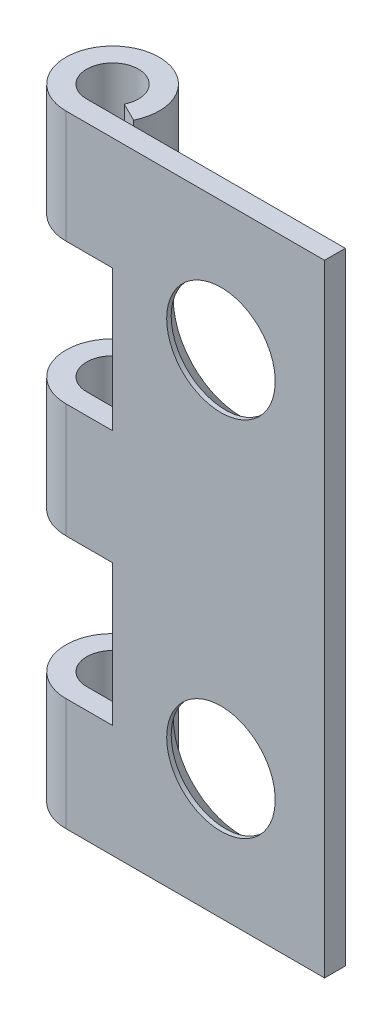
ISO-10303-21;
HEADER;
FILE_DESCRIPTION(('STEP AP214'),'2;1');
FILE_NAME('part.step','',(''),(''),'','','');
FILE_SCHEMA(('AUTOMOTIVE_DESIGN { 1 0 10303 214 1 1 1 1 }'));
ENDSEC;
DATA;
#1=APPLICATION_CONTEXT('core data for automotive mechanical design processes');
#2=APPLICATION_PROTOCOL_DEFINITION('international standard','automotive_design',2000,#1);
#3=PRODUCT_CONTEXT('',#1,'mechanical');
#4=PRODUCT('Part','Part','',(#3));
#5=PRODUCT_RELATED_PRODUCT_CATEGORY('part','',(#4));
#6=PRODUCT_DEFINITION_FORMATION('','',#4);
#7=PRODUCT_DEFINITION_CONTEXT('part definition',#1,'design');
#8=PRODUCT_DEFINITION('design','',#6,#7);
#9=PRODUCT_DEFINITION_SHAPE('','',#8);
#10=(LENGTH_UNIT() NAMED_UNIT(*) SI_UNIT(.MILLI.,.METRE.));
#11=(NAMED_UNIT(*) PLANE_ANGLE_UNIT() SI_UNIT($,.RADIAN.));
#12=(NAMED_UNIT(*) SI_UNIT($,.STERADIAN.) SOLID_ANGLE_UNIT());
#13=UNCERTAINTY_MEASURE_WITH_UNIT(LENGTH_MEASURE(1.E-05),#10,'distance_accuracy_value','');
#14=(GEOMETRIC_REPRESENTATION_CONTEXT(3) GLOBAL_UNCERTAINTY_ASSIGNED_CONTEXT((#13)) GLOBAL_UNIT_ASSIGNED_CONTEXT((#10,
#11,#12)) REPRESENTATION_CONTEXT('',''));
#15=CARTESIAN_POINT('',(0.,0.,0.));
#16=DIRECTION('',(0.,0.,1.));
#17=DIRECTION('',(1.,0.,0.));
#18=AXIS2_PLACEMENT_3D('',#15,#16,#17);
#19=CARTESIAN_POINT('',(0.,9.525,0.));
#20=DIRECTION('',(0.,-1.,0.));
#21=DIRECTION('',(0.,0.,-1.));
#22=AXIS2_PLACEMENT_3D('',#19,#20,#21);
#23=CYLINDRICAL_SURFACE('',#22,0.79375);
#24=DIRECTION('',(0.,-1.,0.));
#25=VECTOR('',#24,1.);
#26=CARTESIAN_POINT('',(0.,9.525,0.79375));
#27=LINE('',#26,#25);
#28=CARTESIAN_POINT('',(0.,1.7526,0.79375));
#29=VERTEX_POINT('',#28);
#30=CARTESIAN_POINT('',(0.,-1.7526,0.79375));
#31=VERTEX_POINT('',#30);
#32=EDGE_CURVE('E276',#29,#31,#27,.T.);
#33=ORIENTED_EDGE('',*,*,#32,.T.);
#34=CARTESIAN_POINT('',(0.,-1.7526,0.));
#35=DIRECTION('',(0.,1.,0.));
#36=DIRECTION('',(0.,0.,1.));
#37=AXIS2_PLACEMENT_3D('',#34,#35,#36);
#38=CIRCLE('',#37,0.79375);
#39=CARTESIAN_POINT('',(0.711046343079108,-1.7526,0.352777777777778));
#40=VERTEX_POINT('',#39);
#41=EDGE_CURVE('E189',#31,#40,#38,.F.);
#42=ORIENTED_EDGE('',*,*,#41,.T.);
#43=DIRECTION('',(0.,-1.,0.));
#44=VECTOR('',#43,1.);
#45=CARTESIAN_POINT('',(0.711046343079108,9.525,0.352777777777778));
#46=LINE('',#45,#44);
#47=CARTESIAN_POINT('',(0.711046343079108,1.7526,0.352777777777778));
#48=VERTEX_POINT('',#47);
#49=EDGE_CURVE('E297',#48,#40,#46,.T.);
#50=ORIENTED_EDGE('',*,*,#49,.F.);
#51=CARTESIAN_POINT('',(0.,1.7526,0.));
#52=DIRECTION('',(0.,-1.,0.));
#53=DIRECTION('',(0.,0.,-1.));
#54=AXIS2_PLACEMENT_3D('',#51,#52,#53);
#55=CIRCLE('',#54,0.79375);
#56=EDGE_CURVE('E207',#48,#29,#55,.F.);
#57=ORIENTED_EDGE('',*,*,#56,.T.);
#58=EDGE_LOOP('',(#33,#42,#50,#57));
#59=FACE_BOUND('',#58,.T.);
#60=ADVANCED_FACE('F33',(#59),#23,.F.);
#61=CARTESIAN_POINT('',(1.2798834175424,9.525,0.635));
#62=DIRECTION('',(0.444444444444444,0.,-0.895806416477617));
#63=DIRECTION('',(-0.895806416477617,0.,-0.444444444444444));
#64=AXIS2_PLACEMENT_3D('',#61,#62,#63);
#65=PLANE('',#64);
#66=ORIENTED_EDGE('',*,*,#49,.T.);
#67=DIRECTION('',(0.895806416477617,0.,0.444444444444444));
#68=VECTOR('',#67,1.);
#69=CARTESIAN_POINT('',(1.2798834175424,-1.7526,0.635));
#70=LINE('',#69,#68);
#71=CARTESIAN_POINT('',(1.2798834175424,-1.7526,0.635));
#72=VERTEX_POINT('',#71);
#73=EDGE_CURVE('E192',#40,#72,#70,.T.);
#74=ORIENTED_EDGE('',*,*,#73,.T.);
#75=DIRECTION('',(0.,-1.,0.));
#76=VECTOR('',#75,1.);
#77=CARTESIAN_POINT('',(1.2798834175424,9.525,0.635));
#78=LINE('',#77,#76);
#79=CARTESIAN_POINT('',(1.2798834175424,1.7526,0.635));
#80=VERTEX_POINT('',#79);
#81=EDGE_CURVE('E292',#80,#72,#78,.T.);
#82=ORIENTED_EDGE('',*,*,#81,.F.);
#83=DIRECTION('',(-0.895806416477617,0.,-0.444444444444444));
#84=VECTOR('',#83,1.);
#85=CARTESIAN_POINT('',(1.2798834175424,1.7526,0.635));
#86=LINE('',#85,#84);
#87=EDGE_CURVE('E211',#80,#48,#86,.T.);
#88=ORIENTED_EDGE('',*,*,#87,.T.);
#89=EDGE_LOOP('',(#66,#74,#82,#88));
#90=FACE_BOUND('',#89,.T.);
#91=ADVANCED_FACE('F320',(#90),#65,.F.);
#92=CARTESIAN_POINT('',(0.,9.525,0.));
#93=DIRECTION('',(0.,-1.,0.));
#94=DIRECTION('',(0.,0.,-1.));
#95=AXIS2_PLACEMENT_3D('',#92,#93,#94);
#96=CYLINDRICAL_SURFACE('',#95,1.42875);
#97=ORIENTED_EDGE('',*,*,#81,.T.);
#98=CARTESIAN_POINT('',(0.,-1.7526,0.));
#99=DIRECTION('',(0.,1.,0.));
#100=DIRECTION('',(0.,0.,1.));
#101=AXIS2_PLACEMENT_3D('',#98,#99,#100);
#102=CIRCLE('',#101,1.42875);
#103=CARTESIAN_POINT('',(0.,-1.7526,1.42875));
#104=VERTEX_POINT('',#103);
#105=EDGE_CURVE('E195',#72,#104,#102,.T.);
#106=ORIENTED_EDGE('',*,*,#105,.T.);
#107=DIRECTION('',(0.,-1.,0.));
#108=VECTOR('',#107,1.);
#109=CARTESIAN_POINT('',(0.,9.525,1.42875));
#110=LINE('',#109,#108);
#111=CARTESIAN_POINT('',(0.,1.7526,1.42875));
#112=VERTEX_POINT('',#111);
#113=EDGE_CURVE('E287',#112,#104,#110,.T.);
#114=ORIENTED_EDGE('',*,*,#113,.F.);
#115=CARTESIAN_POINT('',(0.,1.7526,0.));
#116=DIRECTION('',(0.,-1.,0.));
#117=DIRECTION('',(0.,0.,-1.));
#118=AXIS2_PLACEMENT_3D('',#115,#116,#117);
#119=CIRCLE('',#118,1.42875);
#120=EDGE_CURVE('E214',#112,#80,#119,.T.);
#121=ORIENTED_EDGE('',*,*,#120,.T.);
#122=EDGE_LOOP('',(#97,#106,#114,#121));
#123=FACE_BOUND('',#122,.T.);
#124=ADVANCED_FACE('F329',(#123),#96,.T.);
#125=CARTESIAN_POINT('',(0.,9.525,0.79375));
#126=VERTEX_POINT('',#125);
#127=CARTESIAN_POINT('',(0.,6.0706,0.79375));
#128=VERTEX_POINT('',#127);
#129=EDGE_CURVE('E272',#126,#128,#27,.T.);
#130=ORIENTED_EDGE('',*,*,#129,.T.);
#131=CARTESIAN_POINT('',(0.,6.0706,0.));
#132=DIRECTION('',(0.,1.,0.));
#133=DIRECTION('',(0.,0.,1.));
#134=AXIS2_PLACEMENT_3D('',#131,#132,#133);
#135=CIRCLE('',#134,0.79375);
#136=CARTESIAN_POINT('',(0.711046343079108,6.0706,0.352777777777778));
#137=VERTEX_POINT('',#136);
#138=EDGE_CURVE('E216',#128,#137,#135,.F.);
#139=ORIENTED_EDGE('',*,*,#138,.T.);
#140=CARTESIAN_POINT('',(0.711046343079108,9.525,0.352777777777778));
#141=VERTEX_POINT('',#140);
#142=EDGE_CURVE('E293',#141,#137,#46,.T.);
#143=ORIENTED_EDGE('',*,*,#142,.F.);
#144=CARTESIAN_POINT('',(0.,9.525,0.));
#145=DIRECTION('',(0.,-1.,0.));
#146=DIRECTION('',(0.,0.,1.));
#147=AXIS2_PLACEMENT_3D('',#144,#145,#146);
#148=CIRCLE('',#147,0.79375);
#149=EDGE_CURVE('E243',#126,#141,#148,.T.);
#150=ORIENTED_EDGE('',*,*,#149,.F.);
#151=EDGE_LOOP('',(#130,#139,#143,#150));
#152=FACE_BOUND('',#151,.T.);
#153=ADVANCED_FACE('F366',(#152),#23,.F.);
#154=ORIENTED_EDGE('',*,*,#142,.T.);
#155=DIRECTION('',(0.895806416477617,0.,0.444444444444444));
#156=VECTOR('',#155,1.);
#157=CARTESIAN_POINT('',(1.2798834175424,6.0706,0.635));
#158=LINE('',#157,#156);
#159=CARTESIAN_POINT('',(1.2798834175424,6.0706,0.635));
#160=VERTEX_POINT('',#159);
#161=EDGE_CURVE('E219',#137,#160,#158,.T.);
#162=ORIENTED_EDGE('',*,*,#161,.T.);
#163=CARTESIAN_POINT('',(1.2798834175424,9.525,0.635));
#164=VERTEX_POINT('',#163);
#165=EDGE_CURVE('E288',#164,#160,#78,.T.);
#166=ORIENTED_EDGE('',*,*,#165,.F.);
#167=DIRECTION('',(0.895806416477617,0.,0.444444444444444));
#168=VECTOR('',#167,1.);
#169=CARTESIAN_POINT('',(1.2798834175424,9.525,0.635));
#170=LINE('',#169,#168);
#171=EDGE_CURVE('E246',#141,#164,#170,.T.);
#172=ORIENTED_EDGE('',*,*,#171,.F.);
#173=EDGE_LOOP('',(#154,#162,#166,#172));
#174=FACE_BOUND('',#173,.T.);
#175=ADVANCED_FACE('F369',(#174),#65,.F.);
#176=ORIENTED_EDGE('',*,*,#165,.T.);
#177=CARTESIAN_POINT('',(0.,6.0706,0.));
#178=DIRECTION('',(0.,1.,0.));
#179=DIRECTION('',(0.,0.,1.));
#180=AXIS2_PLACEMENT_3D('',#177,#178,#179);
#181=CIRCLE('',#180,1.42875);
#182=CARTESIAN_POINT('',(0.,6.0706,1.42875));
#183=VERTEX_POINT('',#182);
#184=EDGE_CURVE('E222',#160,#183,#181,.T.);
#185=ORIENTED_EDGE('',*,*,#184,.T.);
#186=CARTESIAN_POINT('',(0.,9.525,1.42875));
#187=VERTEX_POINT('',#186);
#188=EDGE_CURVE('E283',#187,#183,#110,.T.);
#189=ORIENTED_EDGE('',*,*,#188,.F.);
#190=CARTESIAN_POINT('',(0.,9.525,0.));
#191=DIRECTION('',(0.,1.,0.));
#192=DIRECTION('',(0.,0.,1.));
#193=AXIS2_PLACEMENT_3D('',#190,#191,#192);
#194=CIRCLE('',#193,1.42875);
#195=EDGE_CURVE('E249',#164,#187,#194,.T.);
#196=ORIENTED_EDGE('',*,*,#195,.F.);
#197=EDGE_LOOP('',(#176,#185,#189,#196));
#198=FACE_BOUND('',#197,.T.);
#199=ADVANCED_FACE('F355',(#198),#96,.T.);
#200=CARTESIAN_POINT('',(0.711046343079108,-6.0706,0.352777777777778));
#201=VERTEX_POINT('',#200);
#202=CARTESIAN_POINT('',(0.711046343079108,-9.525,0.352777777777778));
#203=VERTEX_POINT('',#202);
#204=EDGE_CURVE('E291',#201,#203,#46,.T.);
#205=ORIENTED_EDGE('',*,*,#204,.F.);
#206=CARTESIAN_POINT('',(0.,-6.0706,0.));
#207=DIRECTION('',(0.,-1.,0.));
#208=DIRECTION('',(0.,0.,-1.));
#209=AXIS2_PLACEMENT_3D('',#206,#207,#208);
#210=CIRCLE('',#209,0.79375);
#211=CARTESIAN_POINT('',(0.,-6.0706,0.79375));
#212=VERTEX_POINT('',#211);
#213=EDGE_CURVE('E181',#201,#212,#210,.F.);
#214=ORIENTED_EDGE('',*,*,#213,.T.);
#215=CARTESIAN_POINT('',(0.,-9.525,0.79375));
#216=VERTEX_POINT('',#215);
#217=EDGE_CURVE('E257',#212,#216,#27,.T.);
#218=ORIENTED_EDGE('',*,*,#217,.T.);
#219=CARTESIAN_POINT('',(0.,-9.525,0.));
#220=DIRECTION('',(0.,-1.,0.));
#221=DIRECTION('',(0.,0.,1.));
#222=AXIS2_PLACEMENT_3D('',#219,#220,#221);
#223=CIRCLE('',#222,0.79375);
#224=EDGE_CURVE('E242',#216,#203,#223,.T.);
#225=ORIENTED_EDGE('',*,*,#224,.T.);
#226=EDGE_LOOP('',(#205,#214,#218,#225));
#227=FACE_BOUND('',#226,.T.);
#228=ADVANCED_FACE('F35',(#227),#23,.F.);
#229=CARTESIAN_POINT('',(1.2798834175424,-6.0706,0.635));
#230=VERTEX_POINT('',#229);
#231=CARTESIAN_POINT('',(1.2798834175424,-9.525,0.635));
#232=VERTEX_POINT('',#231);
#233=EDGE_CURVE('E286',#230,#232,#78,.T.);
#234=ORIENTED_EDGE('',*,*,#233,.F.);
#235=DIRECTION('',(-0.895806416477617,0.,-0.444444444444444));
#236=VECTOR('',#235,1.);
#237=CARTESIAN_POINT('',(1.2798834175424,-6.0706,0.635));
#238=LINE('',#237,#236);
#239=EDGE_CURVE('E185',#230,#201,#238,.T.);
#240=ORIENTED_EDGE('',*,*,#239,.T.);
#241=ORIENTED_EDGE('',*,*,#204,.T.);
#242=DIRECTION('',(0.895806416477617,0.,0.444444444444444));
#243=VECTOR('',#242,1.);
#244=CARTESIAN_POINT('',(1.2798834175424,-9.525,0.635));
#245=LINE('',#244,#243);
#246=EDGE_CURVE('E260',#203,#232,#245,.T.);
#247=ORIENTED_EDGE('',*,*,#246,.T.);
#248=EDGE_LOOP('',(#234,#240,#241,#247));
#249=FACE_BOUND('',#248,.T.);
#250=ADVANCED_FACE('F335',(#249),#65,.F.);
#251=CARTESIAN_POINT('',(0.,-6.0706,0.));
#252=DIRECTION('',(0.,-1.,0.));
#253=DIRECTION('',(0.,0.,-1.));
#254=AXIS2_PLACEMENT_3D('',#251,#252,#253);
#255=CIRCLE('',#254,1.42875);
#256=CARTESIAN_POINT('',(0.,-6.0706,1.42875));
#257=VERTEX_POINT('',#256);
#258=EDGE_CURVE('E159',#257,#230,#255,.T.);
#259=ORIENTED_EDGE('',*,*,#258,.T.);
#260=ORIENTED_EDGE('',*,*,#233,.T.);
#261=CARTESIAN_POINT('',(0.,-9.525,0.));
#262=DIRECTION('',(0.,1.,0.));
#263=DIRECTION('',(0.,0.,1.));
#264=AXIS2_PLACEMENT_3D('',#261,#262,#263);
#265=CIRCLE('',#264,1.42875);
#266=CARTESIAN_POINT('',(0.,-9.525,1.42875));
#267=VERTEX_POINT('',#266);
#268=EDGE_CURVE('E263',#232,#267,#265,.T.);
#269=ORIENTED_EDGE('',*,*,#268,.T.);
#270=EDGE_CURVE('E282',#257,#267,#110,.T.);
#271=ORIENTED_EDGE('',*,*,#270,.F.);
#272=EDGE_LOOP('',(#259,#260,#269,#271));
#273=FACE_BOUND('',#272,.T.);
#274=ADVANCED_FACE('F332',(#273),#96,.T.);
#275=CARTESIAN_POINT('',(7.9248,9.525,1.42875));
#276=DIRECTION('',(0.,0.,-1.));
#277=DIRECTION('',(-1.,0.,0.));
#278=AXIS2_PLACEMENT_3D('',#275,#276,#277);
#279=PLANE('',#278);
#280=CARTESIAN_POINT('',(4.7498,-5.55625,1.42875));
#281=DIRECTION('',(0.,0.,-1.));
#282=DIRECTION('',(-1.,0.,0.));
#283=AXIS2_PLACEMENT_3D('',#280,#281,#282);
#284=CIRCLE('',#283,1.6637);
#285=CARTESIAN_POINT('',(3.0861,-5.55625,1.42875));
#286=VERTEX_POINT('',#285);
#287=EDGE_CURVE('E224',#286,#286,#284,.T.);
#288=ORIENTED_EDGE('',*,*,#287,.T.);
#289=EDGE_LOOP('',(#288));
#290=FACE_BOUND('',#289,.T.);
#291=CARTESIAN_POINT('',(4.7498,5.55625,1.42875));
#292=DIRECTION('',(0.,0.,-1.));
#293=DIRECTION('',(-1.,0.,0.));
#294=AXIS2_PLACEMENT_3D('',#291,#292,#293);
#295=CIRCLE('',#294,1.6637);
#296=CARTESIAN_POINT('',(3.0861,5.55625,1.42875));
#297=VERTEX_POINT('',#296);
#298=EDGE_CURVE('E233',#297,#297,#295,.T.);
#299=ORIENTED_EDGE('',*,*,#298,.T.);
#300=EDGE_LOOP('',(#299));
#301=FACE_BOUND('',#300,.T.);
#302=ORIENTED_EDGE('',*,*,#113,.T.);
#303=DIRECTION('',(-1.,0.,0.));
#304=VECTOR('',#303,1.);
#305=CARTESIAN_POINT('',(-1.42875,-1.7526,1.42875));
#306=LINE('',#305,#304);
#307=CARTESIAN_POINT('',(1.42875,-1.7526,1.42875));
#308=VERTEX_POINT('',#307);
#309=EDGE_CURVE('E173',#308,#104,#306,.T.);
#310=ORIENTED_EDGE('',*,*,#309,.F.);
#311=DIRECTION('',(0.,1.,0.));
#312=VECTOR('',#311,1.);
#313=CARTESIAN_POINT('',(1.42875,-1.7526,1.42875));
#314=LINE('',#313,#312);
#315=CARTESIAN_POINT('',(1.42875,-6.0706,1.42875));
#316=VERTEX_POINT('',#315);
#317=EDGE_CURVE('E163',#316,#308,#314,.T.);
#318=ORIENTED_EDGE('',*,*,#317,.F.);
#319=DIRECTION('',(1.,0.,0.));
#320=VECTOR('',#319,1.);
#321=CARTESIAN_POINT('',(1.42875,-6.0706,1.42875));
#322=LINE('',#321,#320);
#323=EDGE_CURVE('E156',#257,#316,#322,.T.);
#324=ORIENTED_EDGE('',*,*,#323,.F.);
#325=ORIENTED_EDGE('',*,*,#270,.T.);
#326=DIRECTION('',(1.,0.,0.));
#327=VECTOR('',#326,1.);
#328=CARTESIAN_POINT('',(7.9248,-9.525,1.42875));
#329=LINE('',#328,#327);
#330=CARTESIAN_POINT('',(7.9248,-9.525,1.42875));
#331=VERTEX_POINT('',#330);
#332=EDGE_CURVE('E266',#267,#331,#329,.T.);
#333=ORIENTED_EDGE('',*,*,#332,.T.);
#334=DIRECTION('',(0.,-1.,0.));
#335=VECTOR('',#334,1.);
#336=CARTESIAN_POINT('',(7.9248,9.525,1.42875));
#337=LINE('',#336,#335);
#338=CARTESIAN_POINT('',(7.9248,9.525,1.42875));
#339=VERTEX_POINT('',#338);
#340=EDGE_CURVE('E279',#339,#331,#337,.T.);
#341=ORIENTED_EDGE('',*,*,#340,.F.);
#342=DIRECTION('',(1.,0.,0.));
#343=VECTOR('',#342,1.);
#344=CARTESIAN_POINT('',(7.9248,9.525,1.42875));
#345=LINE('',#344,#343);
#346=EDGE_CURVE('E251',#187,#339,#345,.T.);
#347=ORIENTED_EDGE('',*,*,#346,.F.);
#348=ORIENTED_EDGE('',*,*,#188,.T.);
#349=DIRECTION('',(-1.,0.,0.));
#350=VECTOR('',#349,1.);
#351=CARTESIAN_POINT('',(-1.42875,6.0706,1.42875));
#352=LINE('',#351,#350);
#353=CARTESIAN_POINT('',(1.42875,6.0706,1.42875));
#354=VERTEX_POINT('',#353);
#355=EDGE_CURVE('E202',#354,#183,#352,.T.);
#356=ORIENTED_EDGE('',*,*,#355,.F.);
#357=DIRECTION('',(0.,1.,0.));
#358=VECTOR('',#357,1.);
#359=CARTESIAN_POINT('',(1.42875,6.0706,1.42875));
#360=LINE('',#359,#358);
#361=CARTESIAN_POINT('',(1.42875,1.7526,1.42875));
#362=VERTEX_POINT('',#361);
#363=EDGE_CURVE('E199',#362,#354,#360,.T.);
#364=ORIENTED_EDGE('',*,*,#363,.F.);
#365=DIRECTION('',(1.,0.,0.));
#366=VECTOR('',#365,1.);
#367=CARTESIAN_POINT('',(1.42875,1.7526,1.42875));
#368=LINE('',#367,#366);
#369=EDGE_CURVE('E197',#112,#362,#368,.T.);
#370=ORIENTED_EDGE('',*,*,#369,.F.);
#371=EDGE_LOOP('',(#302,#310,#318,#324,#325,#333,#341,#347,#348,#356,#364,#370));
#372=FACE_BOUND('',#371,.T.);
#373=ADVANCED_FACE('F176',(#290,#301,#372),#279,.F.);
#374=CARTESIAN_POINT('',(7.9248,9.525,0.79375));
#375=DIRECTION('',(-1.,0.,0.));
#376=DIRECTION('',(0.,0.,1.));
#377=AXIS2_PLACEMENT_3D('',#374,#375,#376);
#378=PLANE('',#377);
#379=DIRECTION('',(0.,0.,-1.));
#380=VECTOR('',#379,1.);
#381=CARTESIAN_POINT('',(7.9248,-9.525,0.79375));
#382=LINE('',#381,#380);
#383=CARTESIAN_POINT('',(7.9248,-9.525,0.79375));
#384=VERTEX_POINT('',#383);
#385=EDGE_CURVE('E268',#331,#384,#382,.T.);
#386=ORIENTED_EDGE('',*,*,#385,.T.);
#387=DIRECTION('',(0.,-1.,0.));
#388=VECTOR('',#387,1.);
#389=CARTESIAN_POINT('',(7.9248,9.525,0.79375));
#390=LINE('',#389,#388);
#391=CARTESIAN_POINT('',(7.9248,9.525,0.79375));
#392=VERTEX_POINT('',#391);
#393=EDGE_CURVE('E275',#392,#384,#390,.T.);
#394=ORIENTED_EDGE('',*,*,#393,.F.);
#395=DIRECTION('',(0.,0.,-1.));
#396=VECTOR('',#395,1.);
#397=CARTESIAN_POINT('',(7.9248,9.525,0.79375));
#398=LINE('',#397,#396);
#399=EDGE_CURVE('E253',#339,#392,#398,.T.);
#400=ORIENTED_EDGE('',*,*,#399,.F.);
#401=ORIENTED_EDGE('',*,*,#340,.T.);
#402=EDGE_LOOP('',(#386,#394,#400,#401));
#403=FACE_BOUND('',#402,.T.);
#404=ADVANCED_FACE('F344',(#403),#378,.F.);
#405=CARTESIAN_POINT('',(0.,9.525,0.79375));
#406=DIRECTION('',(0.,0.,1.));
#407=DIRECTION('',(1.,0.,0.));
#408=AXIS2_PLACEMENT_3D('',#405,#406,#407);
#409=PLANE('',#408);
#410=CARTESIAN_POINT('',(4.7498,-5.55625,0.79375));
#411=DIRECTION('',(0.,0.,-1.));
#412=DIRECTION('',(-1.,0.,0.));
#413=AXIS2_PLACEMENT_3D('',#410,#411,#412);
#414=CIRCLE('',#413,2.0955);
#415=CARTESIAN_POINT('',(2.6543,-5.55625,0.79375));
#416=VERTEX_POINT('',#415);
#417=EDGE_CURVE('E227',#416,#416,#414,.T.);
#418=ORIENTED_EDGE('',*,*,#417,.F.);
#419=EDGE_LOOP('',(#418));
#420=FACE_BOUND('',#419,.T.);
#421=CARTESIAN_POINT('',(4.7498,5.55625,0.79375));
#422=DIRECTION('',(0.,0.,-1.));
#423=DIRECTION('',(-1.,0.,0.));
#424=AXIS2_PLACEMENT_3D('',#421,#422,#423);
#425=CIRCLE('',#424,2.0955);
#426=CARTESIAN_POINT('',(2.6543,5.55625,0.79375));
#427=VERTEX_POINT('',#426);
#428=EDGE_CURVE('E239',#427,#427,#425,.T.);
#429=ORIENTED_EDGE('',*,*,#428,.F.);
#430=EDGE_LOOP('',(#429));
#431=FACE_BOUND('',#430,.T.);
#432=DIRECTION('',(0.,1.,0.));
#433=VECTOR('',#432,1.);
#434=CARTESIAN_POINT('',(1.42875,9.525,0.79375));
#435=LINE('',#434,#433);
#436=CARTESIAN_POINT('',(1.42875,-6.0706,0.79375));
#437=VERTEX_POINT('',#436);
#438=CARTESIAN_POINT('',(1.42875,-1.7526,0.79375));
#439=VERTEX_POINT('',#438);
#440=EDGE_CURVE('E41',#437,#439,#435,.T.);
#441=ORIENTED_EDGE('',*,*,#440,.T.);
#442=DIRECTION('',(-1.,0.,0.));
#443=VECTOR('',#442,1.);
#444=CARTESIAN_POINT('',(0.,-1.7526,0.79375));
#445=LINE('',#444,#443);
#446=EDGE_CURVE('E11',#439,#31,#445,.T.);
#447=ORIENTED_EDGE('',*,*,#446,.T.);
#448=ORIENTED_EDGE('',*,*,#32,.F.);
#449=DIRECTION('',(1.,0.,0.));
#450=VECTOR('',#449,1.);
#451=CARTESIAN_POINT('',(0.,1.7526,0.79375));
#452=LINE('',#451,#450);
#453=CARTESIAN_POINT('',(1.42875,1.7526,0.79375));
#454=VERTEX_POINT('',#453);
#455=EDGE_CURVE('E296',#29,#454,#452,.T.);
#456=ORIENTED_EDGE('',*,*,#455,.T.);
#457=DIRECTION('',(0.,1.,0.));
#458=VECTOR('',#457,1.);
#459=CARTESIAN_POINT('',(1.42875,9.525,0.79375));
#460=LINE('',#459,#458);
#461=CARTESIAN_POINT('',(1.42875,6.0706,0.79375));
#462=VERTEX_POINT('',#461);
#463=EDGE_CURVE('E300',#454,#462,#460,.T.);
#464=ORIENTED_EDGE('',*,*,#463,.T.);
#465=DIRECTION('',(-1.,0.,0.));
#466=VECTOR('',#465,1.);
#467=CARTESIAN_POINT('',(0.,6.0706,0.79375));
#468=LINE('',#467,#466);
#469=EDGE_CURVE('E303',#462,#128,#468,.T.);
#470=ORIENTED_EDGE('',*,*,#469,.T.);
#471=ORIENTED_EDGE('',*,*,#129,.F.);
#472=DIRECTION('',(-1.,0.,0.));
#473=VECTOR('',#472,1.);
#474=CARTESIAN_POINT('',(0.,9.525,0.79375));
#475=LINE('',#474,#473);
#476=EDGE_CURVE('E255',#392,#126,#475,.T.);
#477=ORIENTED_EDGE('',*,*,#476,.F.);
#478=ORIENTED_EDGE('',*,*,#393,.T.);
#479=DIRECTION('',(-1.,0.,0.));
#480=VECTOR('',#479,1.);
#481=CARTESIAN_POINT('',(0.,-9.525,0.79375));
#482=LINE('',#481,#480);
#483=EDGE_CURVE('E247',#384,#216,#482,.T.);
#484=ORIENTED_EDGE('',*,*,#483,.T.);
#485=ORIENTED_EDGE('',*,*,#217,.F.);
#486=DIRECTION('',(1.,0.,0.));
#487=VECTOR('',#486,1.);
#488=CARTESIAN_POINT('',(0.,-6.0706,0.79375));
#489=LINE('',#488,#487);
#490=EDGE_CURVE('E306',#212,#437,#489,.T.);
#491=ORIENTED_EDGE('',*,*,#490,.T.);
#492=EDGE_LOOP('',(#441,#447,#448,#456,#464,#470,#471,#477,#478,#484,#485,#491));
#493=FACE_BOUND('',#492,.T.);
#494=ADVANCED_FACE('F308',(#420,#431,#493),#409,.F.);
#495=CARTESIAN_POINT('',(0.,9.525,0.));
#496=DIRECTION('',(0.,1.,0.));
#497=DIRECTION('',(0.,0.,1.));
#498=AXIS2_PLACEMENT_3D('',#495,#496,#497);
#499=PLANE('',#498);
#500=ORIENTED_EDGE('',*,*,#149,.T.);
#501=ORIENTED_EDGE('',*,*,#171,.T.);
#502=ORIENTED_EDGE('',*,*,#195,.T.);
#503=ORIENTED_EDGE('',*,*,#346,.T.);
#504=ORIENTED_EDGE('',*,*,#399,.T.);
#505=ORIENTED_EDGE('',*,*,#476,.T.);
#506=EDGE_LOOP('',(#500,#501,#502,#503,#504,#505));
#507=FACE_BOUND('',#506,.T.);
#508=ADVANCED_FACE('F348',(#507),#499,.T.);
#509=CARTESIAN_POINT('',(0.,-9.525,0.));
#510=DIRECTION('',(0.,1.,0.));
#511=DIRECTION('',(0.,0.,1.));
#512=AXIS2_PLACEMENT_3D('',#509,#510,#511);
#513=PLANE('',#512);
#514=ORIENTED_EDGE('',*,*,#224,.F.);
#515=ORIENTED_EDGE('',*,*,#483,.F.);
#516=ORIENTED_EDGE('',*,*,#385,.F.);
#517=ORIENTED_EDGE('',*,*,#332,.F.);
#518=ORIENTED_EDGE('',*,*,#268,.F.);
#519=ORIENTED_EDGE('',*,*,#246,.F.);
#520=EDGE_LOOP('',(#514,#515,#516,#517,#518,#519));
#521=FACE_BOUND('',#520,.T.);
#522=ADVANCED_FACE('F337',(#521),#513,.F.);
#523=CARTESIAN_POINT('',(4.7498,5.55625,0.79375));
#524=DIRECTION('',(0.,0.,-1.));
#525=DIRECTION('',(-1.,0.,0.));
#526=AXIS2_PLACEMENT_3D('',#523,#524,#525);
#527=CONICAL_SURFACE('',#526,2.0955,0.715584993317676);
#528=CARTESIAN_POINT('',(4.7498,5.55625,1.29047907823803));
#529=DIRECTION('',(0.,0.,-1.));
#530=DIRECTION('',(-1.,0.,0.));
#531=AXIS2_PLACEMENT_3D('',#528,#529,#530);
#532=CIRCLE('',#531,1.6637);
#533=CARTESIAN_POINT('',(3.0861,5.55625,1.29047907823803));
#534=VERTEX_POINT('',#533);
#535=EDGE_CURVE('E236',#534,#534,#532,.T.);
#536=ORIENTED_EDGE('',*,*,#535,.F.);
#537=EDGE_LOOP('',(#536));
#538=FACE_BOUND('',#537,.T.);
#539=ORIENTED_EDGE('',*,*,#428,.T.);
#540=EDGE_LOOP('',(#539));
#541=FACE_BOUND('',#540,.T.);
#542=ADVANCED_FACE('F428',(#538,#541),#527,.F.);
#543=CARTESIAN_POINT('',(4.7498,5.55625,-1.82232144301144));
#544=DIRECTION('',(0.,0.,-1.));
#545=DIRECTION('',(-1.,0.,0.));
#546=AXIS2_PLACEMENT_3D('',#543,#544,#545);
#547=CYLINDRICAL_SURFACE('',#546,1.6637);
#548=ORIENTED_EDGE('',*,*,#298,.F.);
#549=EDGE_LOOP('',(#548));
#550=FACE_BOUND('',#549,.T.);
#551=ORIENTED_EDGE('',*,*,#535,.T.);
#552=EDGE_LOOP('',(#551));
#553=FACE_BOUND('',#552,.T.);
#554=ADVANCED_FACE('F435',(#550,#553),#547,.F.);
#555=CARTESIAN_POINT('',(4.7498,-5.55625,0.79375));
#556=DIRECTION('',(0.,0.,-1.));
#557=DIRECTION('',(-1.,0.,0.));
#558=AXIS2_PLACEMENT_3D('',#555,#556,#557);
#559=CONICAL_SURFACE('',#558,2.0955,0.715584993317676);
#560=CARTESIAN_POINT('',(4.7498,-5.55625,1.29047907823803));
#561=DIRECTION('',(0.,0.,-1.));
#562=DIRECTION('',(-1.,0.,0.));
#563=AXIS2_PLACEMENT_3D('',#560,#561,#562);
#564=CIRCLE('',#563,1.6637);
#565=CARTESIAN_POINT('',(3.0861,-5.55625,1.29047907823803));
#566=VERTEX_POINT('',#565);
#567=EDGE_CURVE('E230',#566,#566,#564,.T.);
#568=ORIENTED_EDGE('',*,*,#567,.F.);
#569=EDGE_LOOP('',(#568));
#570=FACE_BOUND('',#569,.T.);
#571=ORIENTED_EDGE('',*,*,#417,.T.);
#572=EDGE_LOOP('',(#571));
#573=FACE_BOUND('',#572,.T.);
#574=ADVANCED_FACE('F443',(#570,#573),#559,.F.);
#575=CARTESIAN_POINT('',(4.7498,-5.55625,-1.82232144301144));
#576=DIRECTION('',(0.,0.,-1.));
#577=DIRECTION('',(-1.,0.,0.));
#578=AXIS2_PLACEMENT_3D('',#575,#576,#577);
#579=CYLINDRICAL_SURFACE('',#578,1.6637);
#580=ORIENTED_EDGE('',*,*,#287,.F.);
#581=EDGE_LOOP('',(#580));
#582=FACE_BOUND('',#581,.T.);
#583=ORIENTED_EDGE('',*,*,#567,.T.);
#584=EDGE_LOOP('',(#583));
#585=FACE_BOUND('',#584,.T.);
#586=ADVANCED_FACE('F451',(#582,#585),#579,.F.);
#587=CARTESIAN_POINT('',(-1.42875,6.0706,-1.42875));
#588=DIRECTION('',(0.,1.,0.));
#589=DIRECTION('',(0.,0.,1.));
#590=AXIS2_PLACEMENT_3D('',#587,#588,#589);
#591=PLANE('',#590);
#592=ORIENTED_EDGE('',*,*,#184,.F.);
#593=ORIENTED_EDGE('',*,*,#161,.F.);
#594=ORIENTED_EDGE('',*,*,#138,.F.);
#595=ORIENTED_EDGE('',*,*,#469,.F.);
#596=DIRECTION('',(0.,0.,1.));
#597=VECTOR('',#596,1.);
#598=CARTESIAN_POINT('',(1.42875,6.0706,-1.42875));
#599=LINE('',#598,#597);
#600=EDGE_CURVE('E205',#462,#354,#599,.T.);
#601=ORIENTED_EDGE('',*,*,#600,.T.);
#602=ORIENTED_EDGE('',*,*,#355,.T.);
#603=EDGE_LOOP('',(#592,#593,#594,#595,#601,#602));
#604=FACE_BOUND('',#603,.T.);
#605=ADVANCED_FACE('F358',(#604),#591,.F.);
#606=CARTESIAN_POINT('',(1.42875,6.0706,-1.42875));
#607=DIRECTION('',(1.,0.,0.));
#608=DIRECTION('',(0.,0.,-1.));
#609=AXIS2_PLACEMENT_3D('',#606,#607,#608);
#610=PLANE('',#609);
#611=DIRECTION('',(0.,0.,1.));
#612=VECTOR('',#611,1.);
#613=CARTESIAN_POINT('',(1.42875,1.7526,-1.42875));
#614=LINE('',#613,#612);
#615=EDGE_CURVE('E56',#454,#362,#614,.T.);
#616=ORIENTED_EDGE('',*,*,#615,.T.);
#617=ORIENTED_EDGE('',*,*,#363,.T.);
#618=ORIENTED_EDGE('',*,*,#600,.F.);
#619=ORIENTED_EDGE('',*,*,#463,.F.);
#620=EDGE_LOOP('',(#616,#617,#618,#619));
#621=FACE_BOUND('',#620,.T.);
#622=ADVANCED_FACE('F361',(#621),#610,.F.);
#623=CARTESIAN_POINT('',(1.42875,1.7526,-1.42875));
#624=DIRECTION('',(0.,-1.,0.));
#625=DIRECTION('',(0.,0.,-1.));
#626=AXIS2_PLACEMENT_3D('',#623,#624,#625);
#627=PLANE('',#626);
#628=ORIENTED_EDGE('',*,*,#369,.T.);
#629=ORIENTED_EDGE('',*,*,#615,.F.);
#630=ORIENTED_EDGE('',*,*,#455,.F.);
#631=ORIENTED_EDGE('',*,*,#56,.F.);
#632=ORIENTED_EDGE('',*,*,#87,.F.);
#633=ORIENTED_EDGE('',*,*,#120,.F.);
#634=EDGE_LOOP('',(#628,#629,#630,#631,#632,#633));
#635=FACE_BOUND('',#634,.T.);
#636=ADVANCED_FACE('F363',(#635),#627,.F.);
#637=CARTESIAN_POINT('',(-1.42875,-1.7526,-1.42875));
#638=DIRECTION('',(0.,1.,0.));
#639=DIRECTION('',(0.,0.,1.));
#640=AXIS2_PLACEMENT_3D('',#637,#638,#639);
#641=PLANE('',#640);
#642=ORIENTED_EDGE('',*,*,#105,.F.);
#643=ORIENTED_EDGE('',*,*,#73,.F.);
#644=ORIENTED_EDGE('',*,*,#41,.F.);
#645=ORIENTED_EDGE('',*,*,#446,.F.);
#646=DIRECTION('',(0.,0.,1.));
#647=VECTOR('',#646,1.);
#648=CARTESIAN_POINT('',(1.42875,-1.7526,-1.42875));
#649=LINE('',#648,#647);
#650=EDGE_CURVE('E172',#439,#308,#649,.T.);
#651=ORIENTED_EDGE('',*,*,#650,.T.);
#652=ORIENTED_EDGE('',*,*,#309,.T.);
#653=EDGE_LOOP('',(#642,#643,#644,#645,#651,#652));
#654=FACE_BOUND('',#653,.T.);
#655=ADVANCED_FACE('F326',(#654),#641,.F.);
#656=CARTESIAN_POINT('',(1.42875,-1.7526,-1.42875));
#657=DIRECTION('',(1.,0.,0.));
#658=DIRECTION('',(0.,0.,-1.));
#659=AXIS2_PLACEMENT_3D('',#656,#657,#658);
#660=PLANE('',#659);
#661=DIRECTION('',(0.,0.,1.));
#662=VECTOR('',#661,1.);
#663=CARTESIAN_POINT('',(1.42875,-6.0706,-1.42875));
#664=LINE('',#663,#662);
#665=EDGE_CURVE('E48',#437,#316,#664,.T.);
#666=ORIENTED_EDGE('',*,*,#665,.T.);
#667=ORIENTED_EDGE('',*,*,#317,.T.);
#668=ORIENTED_EDGE('',*,*,#650,.F.);
#669=ORIENTED_EDGE('',*,*,#440,.F.);
#670=EDGE_LOOP('',(#666,#667,#668,#669));
#671=FACE_BOUND('',#670,.T.);
#672=ADVANCED_FACE('F167',(#671),#660,.F.);
#673=CARTESIAN_POINT('',(1.42875,-6.0706,-1.42875));
#674=DIRECTION('',(0.,-1.,0.));
#675=DIRECTION('',(0.,0.,-1.));
#676=AXIS2_PLACEMENT_3D('',#673,#674,#675);
#677=PLANE('',#676);
#678=ORIENTED_EDGE('',*,*,#323,.T.);
#679=ORIENTED_EDGE('',*,*,#665,.F.);
#680=ORIENTED_EDGE('',*,*,#490,.F.);
#681=ORIENTED_EDGE('',*,*,#213,.F.);
#682=ORIENTED_EDGE('',*,*,#239,.F.);
#683=ORIENTED_EDGE('',*,*,#258,.F.);
#684=EDGE_LOOP('',(#678,#679,#680,#681,#682,#683));
#685=FACE_BOUND('',#684,.T.);
#686=ADVANCED_FACE('F157',(#685),#677,.F.);
#687=CLOSED_SHELL('',(#60,#91,#124,#153,#175,#199,#228,#250,#274,#373,#404,#494,#508,#522,#542,
#554,#574,#586,#605,#622,#636,#655,#672,#686));
#688=MANIFOLD_SOLID_BREP('B2',#687);
#689=ADVANCED_BREP_SHAPE_REPRESENTATION('',(#18,#688),#14);
#690=SHAPE_DEFINITION_REPRESENTATION(#9,#689);
ENDSEC;
END-ISO-10303-21;
